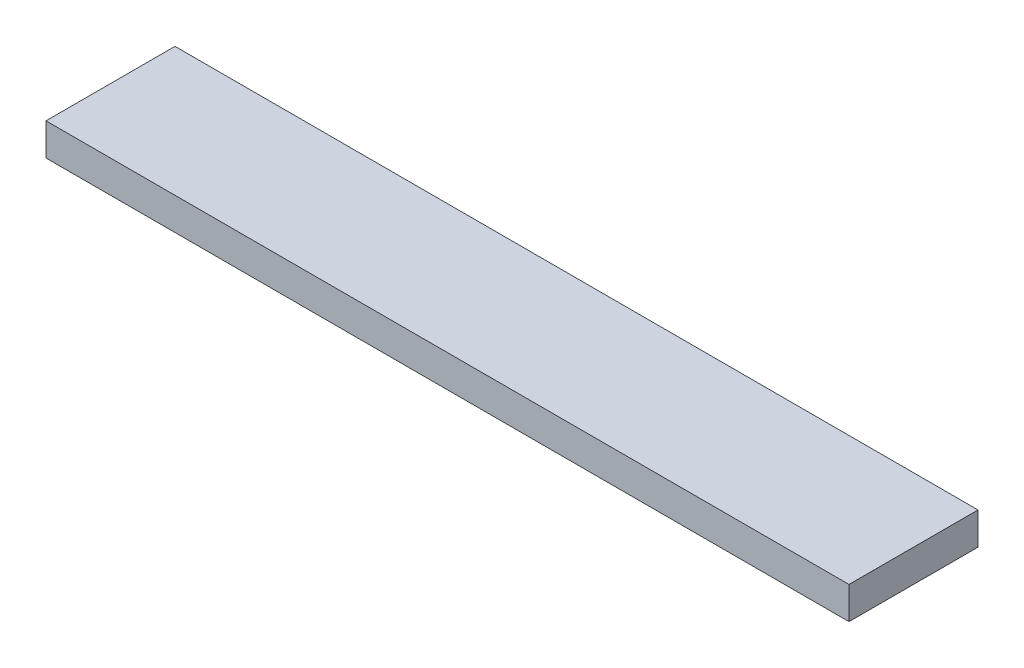
ISO-10303-21;
HEADER;
FILE_DESCRIPTION(('STEP AP214'),'2;1');
FILE_NAME('part.step','',(''),(''),'','','');
FILE_SCHEMA(('AUTOMOTIVE_DESIGN { 1 0 10303 214 1 1 1 1 }'));
ENDSEC;
DATA;
#1=APPLICATION_CONTEXT('core data for automotive mechanical design processes');
#2=APPLICATION_PROTOCOL_DEFINITION('international standard','automotive_design',2000,#1);
#3=PRODUCT_CONTEXT('',#1,'mechanical');
#4=PRODUCT('Part','Part','',(#3));
#5=PRODUCT_RELATED_PRODUCT_CATEGORY('part','',(#4));
#6=PRODUCT_DEFINITION_FORMATION('','',#4);
#7=PRODUCT_DEFINITION_CONTEXT('part definition',#1,'design');
#8=PRODUCT_DEFINITION('design','',#6,#7);
#9=PRODUCT_DEFINITION_SHAPE('','',#8);
#10=(LENGTH_UNIT() NAMED_UNIT(*) SI_UNIT(.MILLI.,.METRE.));
#11=(NAMED_UNIT(*) PLANE_ANGLE_UNIT() SI_UNIT($,.RADIAN.));
#12=(NAMED_UNIT(*) SI_UNIT($,.STERADIAN.) SOLID_ANGLE_UNIT());
#13=UNCERTAINTY_MEASURE_WITH_UNIT(LENGTH_MEASURE(1.E-05),#10,'distance_accuracy_value','');
#14=(GEOMETRIC_REPRESENTATION_CONTEXT(3) GLOBAL_UNCERTAINTY_ASSIGNED_CONTEXT((#13)) GLOBAL_UNIT_ASSIGNED_CONTEXT((#10,
#11,#12)) REPRESENTATION_CONTEXT('',''));
#15=CARTESIAN_POINT('',(0.,0.,0.));
#16=DIRECTION('',(0.,0.,1.));
#17=DIRECTION('',(1.,0.,0.));
#18=AXIS2_PLACEMENT_3D('',#15,#16,#17);
#19=CARTESIAN_POINT('',(0.,5.,0.));
#20=DIRECTION('',(1.,0.,0.));
#21=DIRECTION('',(0.,0.,-1.));
#22=AXIS2_PLACEMENT_3D('',#19,#20,#21);
#23=PLANE('',#22);
#24=DIRECTION('',(0.,0.,1.));
#25=VECTOR('',#24,1.);
#26=CARTESIAN_POINT('',(0.,0.,0.));
#27=LINE('',#26,#25);
#28=CARTESIAN_POINT('',(0.,0.,-20.));
#29=VERTEX_POINT('',#28);
#30=CARTESIAN_POINT('',(0.,0.,0.));
#31=VERTEX_POINT('',#30);
#32=EDGE_CURVE('E107',#29,#31,#27,.T.);
#33=ORIENTED_EDGE('',*,*,#32,.T.);
#34=DIRECTION('',(0.,-1.,0.));
#35=VECTOR('',#34,1.);
#36=CARTESIAN_POINT('',(0.,5.,0.));
#37=LINE('',#36,#35);
#38=CARTESIAN_POINT('',(0.,5.,0.));
#39=VERTEX_POINT('',#38);
#40=EDGE_CURVE('E11',#39,#31,#37,.T.);
#41=ORIENTED_EDGE('',*,*,#40,.F.);
#42=DIRECTION('',(0.,0.,1.));
#43=VECTOR('',#42,1.);
#44=CARTESIAN_POINT('',(0.,5.,0.));
#45=LINE('',#44,#43);
#46=CARTESIAN_POINT('',(0.,5.,-20.));
#47=VERTEX_POINT('',#46);
#48=EDGE_CURVE('E91',#47,#39,#45,.T.);
#49=ORIENTED_EDGE('',*,*,#48,.F.);
#50=DIRECTION('',(0.,-1.,0.));
#51=VECTOR('',#50,1.);
#52=CARTESIAN_POINT('',(0.,5.,-20.));
#53=LINE('',#52,#51);
#54=EDGE_CURVE('E103',#47,#29,#53,.T.);
#55=ORIENTED_EDGE('',*,*,#54,.T.);
#56=EDGE_LOOP('',(#33,#41,#49,#55));
#57=FACE_BOUND('',#56,.T.);
#58=ADVANCED_FACE('F39',(#57),#23,.F.);
#59=CARTESIAN_POINT('',(0.,5.,0.));
#60=DIRECTION('',(0.,0.,-1.));
#61=DIRECTION('',(-1.,0.,0.));
#62=AXIS2_PLACEMENT_3D('',#59,#60,#61);
#63=PLANE('',#62);
#64=DIRECTION('',(1.,0.,0.));
#65=VECTOR('',#64,1.);
#66=CARTESIAN_POINT('',(0.,0.,0.));
#67=LINE('',#66,#65);
#68=CARTESIAN_POINT('',(124.5,0.,0.));
#69=VERTEX_POINT('',#68);
#70=EDGE_CURVE('E96',#31,#69,#67,.T.);
#71=ORIENTED_EDGE('',*,*,#70,.T.);
#72=DIRECTION('',(0.,-1.,0.));
#73=VECTOR('',#72,1.);
#74=CARTESIAN_POINT('',(124.5,5.,0.));
#75=LINE('',#74,#73);
#76=CARTESIAN_POINT('',(124.5,5.,0.));
#77=VERTEX_POINT('',#76);
#78=EDGE_CURVE('E48',#77,#69,#75,.T.);
#79=ORIENTED_EDGE('',*,*,#78,.F.);
#80=DIRECTION('',(1.,0.,0.));
#81=VECTOR('',#80,1.);
#82=CARTESIAN_POINT('',(0.,5.,0.));
#83=LINE('',#82,#81);
#84=EDGE_CURVE('E86',#39,#77,#83,.T.);
#85=ORIENTED_EDGE('',*,*,#84,.F.);
#86=ORIENTED_EDGE('',*,*,#40,.T.);
#87=EDGE_LOOP('',(#71,#79,#85,#86));
#88=FACE_BOUND('',#87,.T.);
#89=ADVANCED_FACE('F95',(#88),#63,.F.);
#90=CARTESIAN_POINT('',(124.5,5.,0.));
#91=DIRECTION('',(-1.,0.,0.));
#92=DIRECTION('',(0.,0.,1.));
#93=AXIS2_PLACEMENT_3D('',#90,#91,#92);
#94=PLANE('',#93);
#95=DIRECTION('',(0.,0.,-1.));
#96=VECTOR('',#95,1.);
#97=CARTESIAN_POINT('',(124.5,0.,0.));
#98=LINE('',#97,#96);
#99=CARTESIAN_POINT('',(124.5,0.,-20.));
#100=VERTEX_POINT('',#99);
#101=EDGE_CURVE('E73',#69,#100,#98,.T.);
#102=ORIENTED_EDGE('',*,*,#101,.T.);
#103=DIRECTION('',(0.,-1.,0.));
#104=VECTOR('',#103,1.);
#105=CARTESIAN_POINT('',(124.5,5.,-20.));
#106=LINE('',#105,#104);
#107=CARTESIAN_POINT('',(124.5,5.,-20.));
#108=VERTEX_POINT('',#107);
#109=EDGE_CURVE('E98',#108,#100,#106,.T.);
#110=ORIENTED_EDGE('',*,*,#109,.F.);
#111=DIRECTION('',(0.,0.,-1.));
#112=VECTOR('',#111,1.);
#113=CARTESIAN_POINT('',(124.5,5.,0.));
#114=LINE('',#113,#112);
#115=EDGE_CURVE('E89',#77,#108,#114,.T.);
#116=ORIENTED_EDGE('',*,*,#115,.F.);
#117=ORIENTED_EDGE('',*,*,#78,.T.);
#118=EDGE_LOOP('',(#102,#110,#116,#117));
#119=FACE_BOUND('',#118,.T.);
#120=ADVANCED_FACE('F99',(#119),#94,.F.);
#121=CARTESIAN_POINT('',(0.,5.,-20.));
#122=DIRECTION('',(0.,0.,1.));
#123=DIRECTION('',(1.,0.,0.));
#124=AXIS2_PLACEMENT_3D('',#121,#122,#123);
#125=PLANE('',#124);
#126=DIRECTION('',(-1.,0.,0.));
#127=VECTOR('',#126,1.);
#128=CARTESIAN_POINT('',(0.,0.,-20.));
#129=LINE('',#128,#127);
#130=EDGE_CURVE('E79',#100,#29,#129,.T.);
#131=ORIENTED_EDGE('',*,*,#130,.T.);
#132=ORIENTED_EDGE('',*,*,#54,.F.);
#133=DIRECTION('',(-1.,0.,0.));
#134=VECTOR('',#133,1.);
#135=CARTESIAN_POINT('',(0.,5.,-20.));
#136=LINE('',#135,#134);
#137=EDGE_CURVE('E56',#108,#47,#136,.T.);
#138=ORIENTED_EDGE('',*,*,#137,.F.);
#139=ORIENTED_EDGE('',*,*,#109,.T.);
#140=EDGE_LOOP('',(#131,#132,#138,#139));
#141=FACE_BOUND('',#140,.T.);
#142=ADVANCED_FACE('F120',(#141),#125,.F.);
#143=CARTESIAN_POINT('',(0.,5.,0.));
#144=DIRECTION('',(0.,-1.,0.));
#145=DIRECTION('',(0.,0.,-1.));
#146=AXIS2_PLACEMENT_3D('',#143,#144,#145);
#147=PLANE('',#146);
#148=ORIENTED_EDGE('',*,*,#48,.T.);
#149=ORIENTED_EDGE('',*,*,#84,.T.);
#150=ORIENTED_EDGE('',*,*,#115,.T.);
#151=ORIENTED_EDGE('',*,*,#137,.T.);
#152=EDGE_LOOP('',(#148,#149,#150,#151));
#153=FACE_BOUND('',#152,.T.);
#154=ADVANCED_FACE('F87',(#153),#147,.F.);
#155=CARTESIAN_POINT('',(0.,0.,0.));
#156=DIRECTION('',(0.,-1.,0.));
#157=DIRECTION('',(0.,0.,-1.));
#158=AXIS2_PLACEMENT_3D('',#155,#156,#157);
#159=PLANE('',#158);
#160=ORIENTED_EDGE('',*,*,#32,.F.);
#161=ORIENTED_EDGE('',*,*,#130,.F.);
#162=ORIENTED_EDGE('',*,*,#101,.F.);
#163=ORIENTED_EDGE('',*,*,#70,.F.);
#164=EDGE_LOOP('',(#160,#161,#162,#163));
#165=FACE_BOUND('',#164,.T.);
#166=ADVANCED_FACE('F123',(#165),#159,.T.);
#167=CLOSED_SHELL('',(#58,#89,#120,#142,#154,#166));
#168=MANIFOLD_SOLID_BREP('B2',#167);
#169=ADVANCED_BREP_SHAPE_REPRESENTATION('',(#18,#168),#14);
#170=SHAPE_DEFINITION_REPRESENTATION(#9,#169);
ENDSEC;
END-ISO-10303-21;
